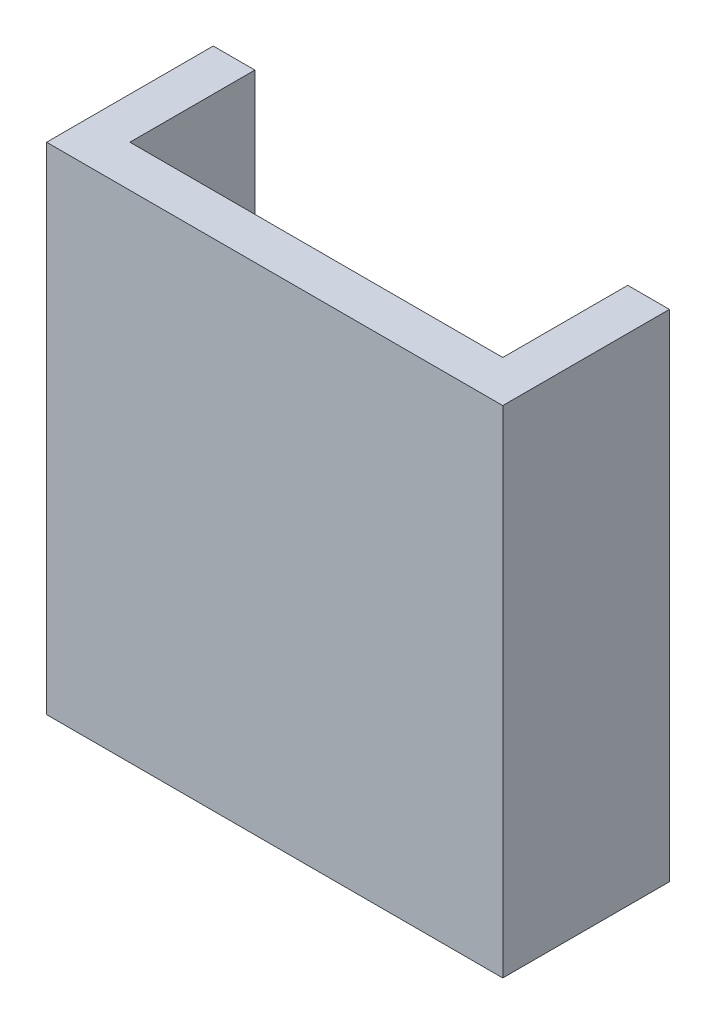
ISO-10303-21;
HEADER;
FILE_DESCRIPTION(('STEP AP214'),'2;1');
FILE_NAME('part.step','',(''),(''),'','','');
FILE_SCHEMA(('AUTOMOTIVE_DESIGN { 1 0 10303 214 1 1 1 1 }'));
ENDSEC;
DATA;
#1=APPLICATION_CONTEXT('core data for automotive mechanical design processes');
#2=APPLICATION_PROTOCOL_DEFINITION('international standard','automotive_design',2000,#1);
#3=PRODUCT_CONTEXT('',#1,'mechanical');
#4=PRODUCT('Part','Part','',(#3));
#5=PRODUCT_RELATED_PRODUCT_CATEGORY('part','',(#4));
#6=PRODUCT_DEFINITION_FORMATION('','',#4);
#7=PRODUCT_DEFINITION_CONTEXT('part definition',#1,'design');
#8=PRODUCT_DEFINITION('design','',#6,#7);
#9=PRODUCT_DEFINITION_SHAPE('','',#8);
#10=(LENGTH_UNIT() NAMED_UNIT(*) SI_UNIT(.MILLI.,.METRE.));
#11=(NAMED_UNIT(*) PLANE_ANGLE_UNIT() SI_UNIT($,.RADIAN.));
#12=(NAMED_UNIT(*) SI_UNIT($,.STERADIAN.) SOLID_ANGLE_UNIT());
#13=UNCERTAINTY_MEASURE_WITH_UNIT(LENGTH_MEASURE(1.E-05),#10,'distance_accuracy_value','');
#14=(GEOMETRIC_REPRESENTATION_CONTEXT(3) GLOBAL_UNCERTAINTY_ASSIGNED_CONTEXT((#13)) GLOBAL_UNIT_ASSIGNED_CONTEXT((#10,
#11,#12)) REPRESENTATION_CONTEXT('',''));
#15=CARTESIAN_POINT('',(0.,0.,0.));
#16=DIRECTION('',(0.,0.,1.));
#17=DIRECTION('',(1.,0.,0.));
#18=AXIS2_PLACEMENT_3D('',#15,#16,#17);
#19=CARTESIAN_POINT('',(-5.475,5.45,4.));
#20=DIRECTION('',(0.,-1.,0.));
#21=DIRECTION('',(0.,0.,-1.));
#22=AXIS2_PLACEMENT_3D('',#19,#20,#21);
#23=PLANE('',#22);
#24=DIRECTION('',(0.,0.,-1.));
#25=VECTOR('',#24,1.);
#26=CARTESIAN_POINT('',(-4.475,5.45,3.));
#27=LINE('',#26,#25);
#28=CARTESIAN_POINT('',(-4.475,5.45,3.));
#29=VERTEX_POINT('',#28);
#30=CARTESIAN_POINT('',(-4.475,5.45,0.));
#31=VERTEX_POINT('',#30);
#32=EDGE_CURVE('E132',#29,#31,#27,.T.);
#33=ORIENTED_EDGE('',*,*,#32,.T.);
#34=DIRECTION('',(-1.,0.,0.));
#35=VECTOR('',#34,1.);
#36=CARTESIAN_POINT('',(-5.475,5.45,0.));
#37=LINE('',#36,#35);
#38=CARTESIAN_POINT('',(-5.475,5.45,0.));
#39=VERTEX_POINT('',#38);
#40=EDGE_CURVE('E85',#31,#39,#37,.T.);
#41=ORIENTED_EDGE('',*,*,#40,.T.);
#42=DIRECTION('',(0.,0.,-1.));
#43=VECTOR('',#42,1.);
#44=CARTESIAN_POINT('',(-5.475,5.45,4.));
#45=LINE('',#44,#43);
#46=CARTESIAN_POINT('',(-5.475,5.45,4.));
#47=VERTEX_POINT('',#46);
#48=EDGE_CURVE('E161',#47,#39,#45,.T.);
#49=ORIENTED_EDGE('',*,*,#48,.F.);
#50=DIRECTION('',(-1.,0.,0.));
#51=VECTOR('',#50,1.);
#52=CARTESIAN_POINT('',(-5.475,5.45,4.));
#53=LINE('',#52,#51);
#54=CARTESIAN_POINT('',(5.475,5.45,4.));
#55=VERTEX_POINT('',#54);
#56=EDGE_CURVE('E64',#55,#47,#53,.T.);
#57=ORIENTED_EDGE('',*,*,#56,.F.);
#58=DIRECTION('',(0.,0.,-1.));
#59=VECTOR('',#58,1.);
#60=CARTESIAN_POINT('',(5.475,5.45,4.));
#61=LINE('',#60,#59);
#62=CARTESIAN_POINT('',(5.475,5.45,0.));
#63=VERTEX_POINT('',#62);
#64=EDGE_CURVE('E173',#55,#63,#61,.T.);
#65=ORIENTED_EDGE('',*,*,#64,.T.);
#66=CARTESIAN_POINT('',(4.475,5.45,0.));
#67=VERTEX_POINT('',#66);
#68=EDGE_CURVE('E154',#63,#67,#37,.T.);
#69=ORIENTED_EDGE('',*,*,#68,.T.);
#70=DIRECTION('',(0.,0.,-1.));
#71=VECTOR('',#70,1.);
#72=CARTESIAN_POINT('',(4.475,5.45,3.));
#73=LINE('',#72,#71);
#74=CARTESIAN_POINT('',(4.475,5.45,3.));
#75=VERTEX_POINT('',#74);
#76=EDGE_CURVE('E55',#75,#67,#73,.T.);
#77=ORIENTED_EDGE('',*,*,#76,.F.);
#78=DIRECTION('',(-1.,0.,0.));
#79=VECTOR('',#78,1.);
#80=CARTESIAN_POINT('',(-4.475,5.45,3.));
#81=LINE('',#80,#79);
#82=EDGE_CURVE('E217',#75,#29,#81,.T.);
#83=ORIENTED_EDGE('',*,*,#82,.T.);
#84=EDGE_LOOP('',(#33,#41,#49,#57,#65,#69,#77,#83));
#85=FACE_BOUND('',#84,.T.);
#86=ADVANCED_FACE('F39',(#85),#23,.F.);
#87=CARTESIAN_POINT('',(0.,0.,0.));
#88=DIRECTION('',(0.,0.,1.));
#89=DIRECTION('',(1.,0.,0.));
#90=AXIS2_PLACEMENT_3D('',#87,#88,#89);
#91=PLANE('',#90);
#92=DIRECTION('',(0.,-1.,0.));
#93=VECTOR('',#92,1.);
#94=CARTESIAN_POINT('',(-4.475,5.45,0.));
#95=LINE('',#94,#93);
#96=CARTESIAN_POINT('',(-4.475,-5.45,0.));
#97=VERTEX_POINT('',#96);
#98=EDGE_CURVE('E210',#31,#97,#95,.T.);
#99=ORIENTED_EDGE('',*,*,#98,.T.);
#100=DIRECTION('',(1.,0.,0.));
#101=VECTOR('',#100,1.);
#102=CARTESIAN_POINT('',(-4.475,-5.45,0.));
#103=LINE('',#102,#101);
#104=CARTESIAN_POINT('',(4.475,-5.45,0.));
#105=VERTEX_POINT('',#104);
#106=EDGE_CURVE('E138',#97,#105,#103,.T.);
#107=ORIENTED_EDGE('',*,*,#106,.T.);
#108=DIRECTION('',(0.,1.,0.));
#109=VECTOR('',#108,1.);
#110=CARTESIAN_POINT('',(4.475,5.45,0.));
#111=LINE('',#110,#109);
#112=EDGE_CURVE('E134',#105,#67,#111,.T.);
#113=ORIENTED_EDGE('',*,*,#112,.T.);
#114=ORIENTED_EDGE('',*,*,#68,.F.);
#115=DIRECTION('',(0.,1.,0.));
#116=VECTOR('',#115,1.);
#117=CARTESIAN_POINT('',(5.475,5.45,0.));
#118=LINE('',#117,#116);
#119=CARTESIAN_POINT('',(5.475,-6.45,0.));
#120=VERTEX_POINT('',#119);
#121=EDGE_CURVE('E165',#120,#63,#118,.T.);
#122=ORIENTED_EDGE('',*,*,#121,.F.);
#123=DIRECTION('',(1.,0.,0.));
#124=VECTOR('',#123,1.);
#125=CARTESIAN_POINT('',(-5.475,-6.45,0.));
#126=LINE('',#125,#124);
#127=CARTESIAN_POINT('',(-5.475,-6.45,0.));
#128=VERTEX_POINT('',#127);
#129=EDGE_CURVE('E146',#128,#120,#126,.T.);
#130=ORIENTED_EDGE('',*,*,#129,.F.);
#131=DIRECTION('',(0.,-1.,0.));
#132=VECTOR('',#131,1.);
#133=CARTESIAN_POINT('',(-5.475,5.45,0.));
#134=LINE('',#133,#132);
#135=EDGE_CURVE('E140',#39,#128,#134,.T.);
#136=ORIENTED_EDGE('',*,*,#135,.F.);
#137=ORIENTED_EDGE('',*,*,#40,.F.);
#138=EDGE_LOOP('',(#99,#107,#113,#114,#122,#130,#136,#137));
#139=FACE_BOUND('',#138,.T.);
#140=ADVANCED_FACE('F185',(#139),#91,.F.);
#141=CARTESIAN_POINT('',(-5.475,5.45,4.));
#142=DIRECTION('',(1.,0.,0.));
#143=DIRECTION('',(0.,1.,0.));
#144=AXIS2_PLACEMENT_3D('',#141,#142,#143);
#145=PLANE('',#144);
#146=ORIENTED_EDGE('',*,*,#135,.T.);
#147=DIRECTION('',(0.,0.,-1.));
#148=VECTOR('',#147,1.);
#149=CARTESIAN_POINT('',(-5.475,-6.45,4.));
#150=LINE('',#149,#148);
#151=CARTESIAN_POINT('',(-5.475,-6.45,4.));
#152=VERTEX_POINT('',#151);
#153=EDGE_CURVE('E11',#152,#128,#150,.T.);
#154=ORIENTED_EDGE('',*,*,#153,.F.);
#155=DIRECTION('',(0.,-1.,0.));
#156=VECTOR('',#155,1.);
#157=CARTESIAN_POINT('',(-5.475,5.45,4.));
#158=LINE('',#157,#156);
#159=EDGE_CURVE('E151',#47,#152,#158,.T.);
#160=ORIENTED_EDGE('',*,*,#159,.F.);
#161=ORIENTED_EDGE('',*,*,#48,.T.);
#162=EDGE_LOOP('',(#146,#154,#160,#161));
#163=FACE_BOUND('',#162,.T.);
#164=ADVANCED_FACE('F41',(#163),#145,.F.);
#165=CARTESIAN_POINT('',(-5.475,-6.45,4.));
#166=DIRECTION('',(0.,1.,0.));
#167=DIRECTION('',(0.,0.,1.));
#168=AXIS2_PLACEMENT_3D('',#165,#166,#167);
#169=PLANE('',#168);
#170=ORIENTED_EDGE('',*,*,#129,.T.);
#171=DIRECTION('',(0.,0.,-1.));
#172=VECTOR('',#171,1.);
#173=CARTESIAN_POINT('',(5.475,-6.45,4.));
#174=LINE('',#173,#172);
#175=CARTESIAN_POINT('',(5.475,-6.45,4.));
#176=VERTEX_POINT('',#175);
#177=EDGE_CURVE('E48',#176,#120,#174,.T.);
#178=ORIENTED_EDGE('',*,*,#177,.F.);
#179=DIRECTION('',(1.,0.,0.));
#180=VECTOR('',#179,1.);
#181=CARTESIAN_POINT('',(-5.475,-6.45,4.));
#182=LINE('',#181,#180);
#183=EDGE_CURVE('E92',#152,#176,#182,.T.);
#184=ORIENTED_EDGE('',*,*,#183,.F.);
#185=ORIENTED_EDGE('',*,*,#153,.T.);
#186=EDGE_LOOP('',(#170,#178,#184,#185));
#187=FACE_BOUND('',#186,.T.);
#188=ADVANCED_FACE('F198',(#187),#169,.F.);
#189=CARTESIAN_POINT('',(5.475,5.45,4.));
#190=DIRECTION('',(-1.,0.,0.));
#191=DIRECTION('',(0.,0.,1.));
#192=AXIS2_PLACEMENT_3D('',#189,#190,#191);
#193=PLANE('',#192);
#194=ORIENTED_EDGE('',*,*,#121,.T.);
#195=ORIENTED_EDGE('',*,*,#64,.F.);
#196=DIRECTION('',(0.,1.,0.));
#197=VECTOR('',#196,1.);
#198=CARTESIAN_POINT('',(5.475,5.45,4.));
#199=LINE('',#198,#197);
#200=EDGE_CURVE('E157',#176,#55,#199,.T.);
#201=ORIENTED_EDGE('',*,*,#200,.F.);
#202=ORIENTED_EDGE('',*,*,#177,.T.);
#203=EDGE_LOOP('',(#194,#195,#201,#202));
#204=FACE_BOUND('',#203,.T.);
#205=ADVANCED_FACE('F181',(#204),#193,.F.);
#206=CARTESIAN_POINT('',(0.,0.,4.));
#207=DIRECTION('',(0.,0.,1.));
#208=DIRECTION('',(1.,0.,0.));
#209=AXIS2_PLACEMENT_3D('',#206,#207,#208);
#210=PLANE('',#209);
#211=ORIENTED_EDGE('',*,*,#159,.T.);
#212=ORIENTED_EDGE('',*,*,#183,.T.);
#213=ORIENTED_EDGE('',*,*,#200,.T.);
#214=ORIENTED_EDGE('',*,*,#56,.T.);
#215=EDGE_LOOP('',(#211,#212,#213,#214));
#216=FACE_BOUND('',#215,.T.);
#217=ADVANCED_FACE('F190',(#216),#210,.T.);
#218=CARTESIAN_POINT('',(-4.475,5.45,3.));
#219=DIRECTION('',(1.,0.,0.));
#220=DIRECTION('',(0.,1.,0.));
#221=AXIS2_PLACEMENT_3D('',#218,#219,#220);
#222=PLANE('',#221);
#223=ORIENTED_EDGE('',*,*,#98,.F.);
#224=ORIENTED_EDGE('',*,*,#32,.F.);
#225=DIRECTION('',(0.,-1.,0.));
#226=VECTOR('',#225,1.);
#227=CARTESIAN_POINT('',(-4.475,5.45,3.));
#228=LINE('',#227,#226);
#229=CARTESIAN_POINT('',(-4.475,-5.45,3.));
#230=VERTEX_POINT('',#229);
#231=EDGE_CURVE('E119',#29,#230,#228,.T.);
#232=ORIENTED_EDGE('',*,*,#231,.T.);
#233=DIRECTION('',(0.,0.,-1.));
#234=VECTOR('',#233,1.);
#235=CARTESIAN_POINT('',(-4.475,-5.45,3.));
#236=LINE('',#235,#234);
#237=EDGE_CURVE('E130',#230,#97,#236,.T.);
#238=ORIENTED_EDGE('',*,*,#237,.T.);
#239=EDGE_LOOP('',(#223,#224,#232,#238));
#240=FACE_BOUND('',#239,.T.);
#241=ADVANCED_FACE('F129',(#240),#222,.T.);
#242=CARTESIAN_POINT('',(-4.475,-5.45,3.));
#243=DIRECTION('',(0.,1.,0.));
#244=DIRECTION('',(0.,0.,1.));
#245=AXIS2_PLACEMENT_3D('',#242,#243,#244);
#246=PLANE('',#245);
#247=ORIENTED_EDGE('',*,*,#106,.F.);
#248=ORIENTED_EDGE('',*,*,#237,.F.);
#249=DIRECTION('',(1.,0.,0.));
#250=VECTOR('',#249,1.);
#251=CARTESIAN_POINT('',(-4.475,-5.45,3.));
#252=LINE('',#251,#250);
#253=CARTESIAN_POINT('',(4.475,-5.45,3.));
#254=VERTEX_POINT('',#253);
#255=EDGE_CURVE('E115',#230,#254,#252,.T.);
#256=ORIENTED_EDGE('',*,*,#255,.T.);
#257=DIRECTION('',(0.,0.,-1.));
#258=VECTOR('',#257,1.);
#259=CARTESIAN_POINT('',(4.475,-5.45,3.));
#260=LINE('',#259,#258);
#261=EDGE_CURVE('E141',#254,#105,#260,.T.);
#262=ORIENTED_EDGE('',*,*,#261,.T.);
#263=EDGE_LOOP('',(#247,#248,#256,#262));
#264=FACE_BOUND('',#263,.T.);
#265=ADVANCED_FACE('F136',(#264),#246,.T.);
#266=CARTESIAN_POINT('',(4.475,5.45,3.));
#267=DIRECTION('',(-1.,0.,0.));
#268=DIRECTION('',(0.,0.,1.));
#269=AXIS2_PLACEMENT_3D('',#266,#267,#268);
#270=PLANE('',#269);
#271=ORIENTED_EDGE('',*,*,#112,.F.);
#272=ORIENTED_EDGE('',*,*,#261,.F.);
#273=DIRECTION('',(0.,1.,0.));
#274=VECTOR('',#273,1.);
#275=CARTESIAN_POINT('',(4.475,5.45,3.));
#276=LINE('',#275,#274);
#277=EDGE_CURVE('E121',#254,#75,#276,.T.);
#278=ORIENTED_EDGE('',*,*,#277,.T.);
#279=ORIENTED_EDGE('',*,*,#76,.T.);
#280=EDGE_LOOP('',(#271,#272,#278,#279));
#281=FACE_BOUND('',#280,.T.);
#282=ADVANCED_FACE('F226',(#281),#270,.T.);
#283=CARTESIAN_POINT('',(0.,0.,3.));
#284=DIRECTION('',(0.,0.,1.));
#285=DIRECTION('',(1.,0.,0.));
#286=AXIS2_PLACEMENT_3D('',#283,#284,#285);
#287=PLANE('',#286);
#288=ORIENTED_EDGE('',*,*,#231,.F.);
#289=ORIENTED_EDGE('',*,*,#82,.F.);
#290=ORIENTED_EDGE('',*,*,#277,.F.);
#291=ORIENTED_EDGE('',*,*,#255,.F.);
#292=EDGE_LOOP('',(#288,#289,#290,#291));
#293=FACE_BOUND('',#292,.T.);
#294=ADVANCED_FACE('F117',(#293),#287,.F.);
#295=CLOSED_SHELL('',(#86,#140,#164,#188,#205,#217,#241,#265,#282,#294));
#296=MANIFOLD_SOLID_BREP('B2',#295);
#297=ADVANCED_BREP_SHAPE_REPRESENTATION('',(#18,#296),#14);
#298=SHAPE_DEFINITION_REPRESENTATION(#9,#297);
ENDSEC;
END-ISO-10303-21;
